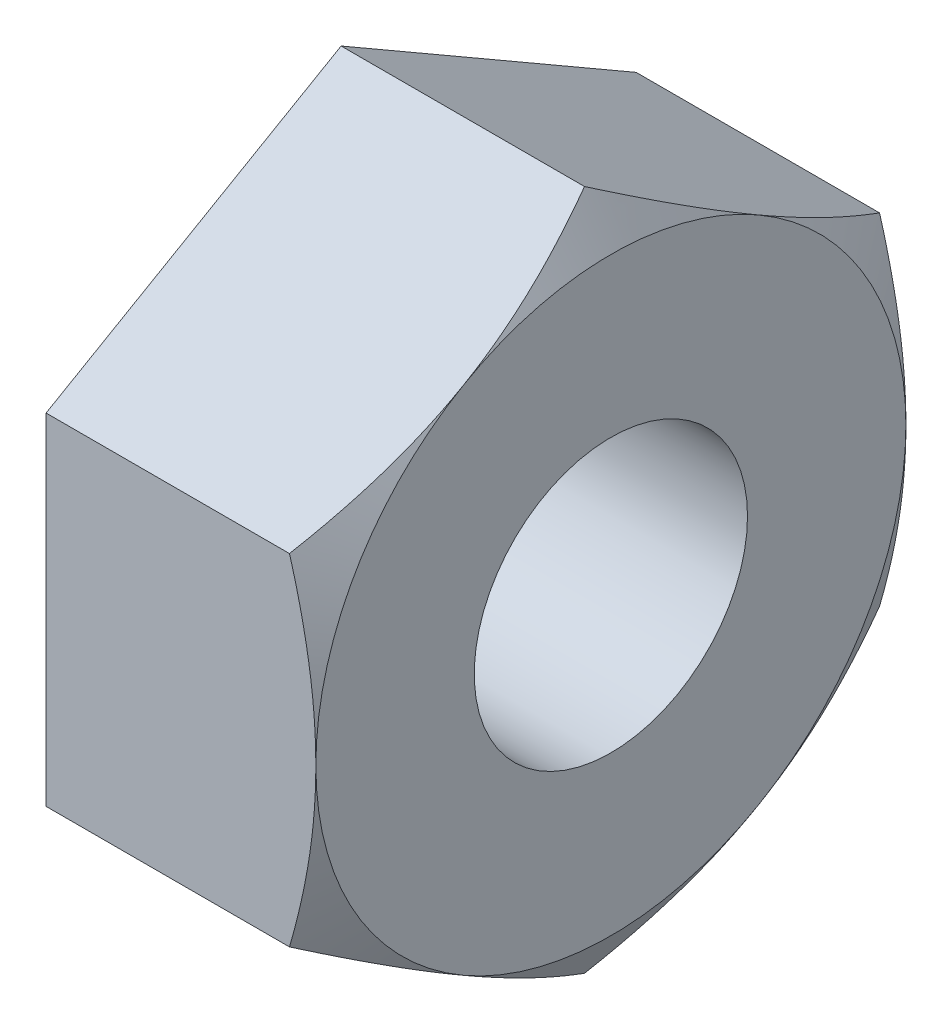
ISO-10303-21;
HEADER;
FILE_DESCRIPTION(('STEP AP214'),'2;1');
FILE_NAME('part.step','',(''),(''),'','','');
FILE_SCHEMA(('AUTOMOTIVE_DESIGN { 1 0 10303 214 1 1 1 1 }'));
ENDSEC;
DATA;
#1=APPLICATION_CONTEXT('core data for automotive mechanical design processes');
#2=APPLICATION_PROTOCOL_DEFINITION('international standard','automotive_design',2000,#1);
#3=PRODUCT_CONTEXT('',#1,'mechanical');
#4=PRODUCT('Part','Part','',(#3));
#5=PRODUCT_RELATED_PRODUCT_CATEGORY('part','',(#4));
#6=PRODUCT_DEFINITION_FORMATION('','',#4);
#7=PRODUCT_DEFINITION_CONTEXT('part definition',#1,'design');
#8=PRODUCT_DEFINITION('design','',#6,#7);
#9=PRODUCT_DEFINITION_SHAPE('','',#8);
#10=(LENGTH_UNIT() NAMED_UNIT(*) SI_UNIT(.MILLI.,.METRE.));
#11=(NAMED_UNIT(*) PLANE_ANGLE_UNIT() SI_UNIT($,.RADIAN.));
#12=(NAMED_UNIT(*) SI_UNIT($,.STERADIAN.) SOLID_ANGLE_UNIT());
#13=UNCERTAINTY_MEASURE_WITH_UNIT(LENGTH_MEASURE(1.E-05),#10,'distance_accuracy_value','');
#14=(GEOMETRIC_REPRESENTATION_CONTEXT(3) GLOBAL_UNCERTAINTY_ASSIGNED_CONTEXT((#13)) GLOBAL_UNIT_ASSIGNED_CONTEXT((#10,
#11,#12)) REPRESENTATION_CONTEXT('',''));
#15=CARTESIAN_POINT('',(0.,0.,0.));
#16=DIRECTION('',(0.,0.,1.));
#17=DIRECTION('',(1.,0.,0.));
#18=AXIS2_PLACEMENT_3D('',#15,#16,#17);
#19=CARTESIAN_POINT('',(-3.2,2.02072594216368,-3.5));
#20=DIRECTION('',(0.,0.866025403784439,-0.5));
#21=DIRECTION('',(0.,0.5,0.866025403784439));
#22=AXIS2_PLACEMENT_3D('',#19,#20,#21);
#23=PLANE('',#22);
#24=DIRECTION('',(1.,0.,0.));
#25=VECTOR('',#24,1.);
#26=CARTESIAN_POINT('',(-3.2,4.04145188432737,0.));
#27=LINE('',#26,#25);
#28=CARTESIAN_POINT('',(-3.2,4.04145188432737,0.));
#29=VERTEX_POINT('',#28);
#30=CARTESIAN_POINT('',(-0.312607391169632,4.04145188432737,0.));
#31=VERTEX_POINT('',#30);
#32=EDGE_CURVE('E213',#29,#31,#27,.T.);
#33=ORIENTED_EDGE('',*,*,#32,.T.);
#34=CARTESIAN_POINT('',(-0.31267406069336,4.04156735438121,0.000199999999999771));
#35=CARTESIAN_POINT('',(-0.261385788989973,3.95276673849839,-0.153607178452449));
#36=CARTESIAN_POINT('',(-0.214740953816187,3.86319960126197,-0.308742010834423));
#37=CARTESIAN_POINT('',(-0.13332187553334,3.68251437287561,-0.621698006576779));
#38=CARTESIAN_POINT('',(-0.0985764355845537,3.59139307116724,-0.779524730787493));
#39=CARTESIAN_POINT('',(-0.0444900271828293,3.41027974688033,-1.09322221038012));
#40=CARTESIAN_POINT('',(-0.0247890862603751,3.32031559103707,-1.24904469916069));
#41=CARTESIAN_POINT('',(-0.00127013273724807,3.13996396008051,-1.56142288720537));
#42=CARTESIAN_POINT('',(0.00256735545444128,3.04957714051105,-1.71797745103422));
#43=CARTESIAN_POINT('',(-0.00541530187697106,2.88068384499776,-2.01050921992098));
#44=CARTESIAN_POINT('',(-0.0152754340696007,2.80215208834114,-2.1465302124579));
#45=CARTESIAN_POINT('',(-0.0465264668993971,2.64560020969753,-2.41768602028899));
#46=CARTESIAN_POINT('',(-0.0679280432857915,2.56758062920649,-2.55281989768468));
#47=CARTESIAN_POINT('',(-0.12143040788057,2.41070596159677,-2.82453479240518));
#48=CARTESIAN_POINT('',(-0.15375799444508,2.33187072981462,-2.96108141927833));
#49=CARTESIAN_POINT('',(-0.227128933807987,2.17537608630782,-3.2321380929445));
#50=CARTESIAN_POINT('',(-0.268155046569859,2.09771466960097,-3.36665161246854));
#51=CARTESIAN_POINT('',(-0.312674060693363,2.02061047210984,-3.5002));
#52=B_SPLINE_CURVE_WITH_KNOTS('',3,(#34,#35,#36,#37,#38,#39,#40,#41,#42,#43,#44,#45,#46,#47,#48,
#49,#50,#51),.UNSPECIFIED.,.F.,.F.,(4,2,2,2,2,2,2,2,4),(0.,0.554793832886251,1.11092123814983,
1.65328467083218,2.19498204478402,2.66665130850859,3.13875761298267,3.62133612600509,
4.10296698719187),.UNSPECIFIED.);
#53=CARTESIAN_POINT('',(0.,3.03108891324554,-1.75));
#54=VERTEX_POINT('',#53);
#55=EDGE_CURVE('E58',#31,#54,#52,.T.);
#56=ORIENTED_EDGE('',*,*,#55,.T.);
#57=CARTESIAN_POINT('',(-0.312607391169632,2.02072594216367,-3.5));
#58=VERTEX_POINT('',#57);
#59=EDGE_CURVE('E185',#54,#58,#52,.T.);
#60=ORIENTED_EDGE('',*,*,#59,.T.);
#61=DIRECTION('',(1.,0.,0.));
#62=VECTOR('',#61,1.);
#63=CARTESIAN_POINT('',(-3.2,2.02072594216368,-3.5));
#64=LINE('',#63,#62);
#65=CARTESIAN_POINT('',(-3.2,2.02072594216368,-3.5));
#66=VERTEX_POINT('',#65);
#67=EDGE_CURVE('E233',#66,#58,#64,.T.);
#68=ORIENTED_EDGE('',*,*,#67,.F.);
#69=DIRECTION('',(0.,0.5,0.866025403784439));
#70=VECTOR('',#69,1.);
#71=CARTESIAN_POINT('',(-3.2,2.02072594216368,-3.5));
#72=LINE('',#71,#70);
#73=EDGE_CURVE('E216',#66,#29,#72,.T.);
#74=ORIENTED_EDGE('',*,*,#73,.T.);
#75=EDGE_LOOP('',(#33,#56,#60,#68,#74));
#76=FACE_BOUND('',#75,.T.);
#77=ADVANCED_FACE('F36',(#76),#23,.T.);
#78=CARTESIAN_POINT('',(-3.2,-2.0207259421637,-3.5));
#79=DIRECTION('',(0.,0.,-1.));
#80=DIRECTION('',(0.,1.,0.));
#81=AXIS2_PLACEMENT_3D('',#78,#79,#80);
#82=PLANE('',#81);
#83=ORIENTED_EDGE('',*,*,#67,.T.);
#84=CARTESIAN_POINT('',(-1.6748440724779,-5.35926424048624,-3.5));
#85=CARTESIAN_POINT('',(-1.60058231497446,-5.20559440559576,-3.5));
#86=CARTESIAN_POINT('',(-1.52705878056118,-5.0515612445436,-3.5));
#87=CARTESIAN_POINT('',(-1.38191000416732,-4.74257181977884,-3.5));
#88=CARTESIAN_POINT('',(-1.31028509085496,-4.58761540185548,-3.5));
#89=CARTESIAN_POINT('',(-1.16897807882459,-4.27574595068726,-3.5));
#90=CARTESIAN_POINT('',(-1.09930944363486,-4.1188267950521,-3.5));
#91=CARTESIAN_POINT('',(-0.962964609282973,-3.80369874616066,-3.5));
#92=CARTESIAN_POINT('',(-0.896288254138832,-3.64548992064166,-3.5));
#93=CARTESIAN_POINT('',(-0.765932090906342,-3.32556686799685,-3.5));
#94=CARTESIAN_POINT('',(-0.702299120726499,-3.16383345099895,-3.5));
#95=CARTESIAN_POINT('',(-0.580016900953806,-2.8384589571423,-3.5));
#96=CARTESIAN_POINT('',(-0.521368205835812,-2.67481767033958,-3.5));
#97=CARTESIAN_POINT('',(-0.410630410873417,-2.34570319373404,-3.5));
#98=CARTESIAN_POINT('',(-0.358527365355124,-2.18023474470139,-3.5));
#99=CARTESIAN_POINT('',(-0.262573008307886,-1.84694549539022,-3.5));
#100=CARTESIAN_POINT('',(-0.218719087285585,-1.67912545711475,-3.5));
#101=CARTESIAN_POINT('',(-0.141391963972235,-1.34101838256747,-3.5));
#102=CARTESIAN_POINT('',(-0.107921527224786,-1.1707307016812,-3.5));
#103=CARTESIAN_POINT('',(-0.0536149371423589,-0.828102254748888,-3.5));
#104=CARTESIAN_POINT('',(-0.0327787949694608,-0.655761486889137,-3.5));
#105=CARTESIAN_POINT('',(-0.00558406591599609,-0.311020130690051,-3.5));
#106=CARTESIAN_POINT('',(0.000866175296537027,-0.138626960610233,-3.5));
#107=CARTESIAN_POINT('',(-0.00105357590517546,0.206038662929245,-3.5));
#108=CARTESIAN_POINT('',(-0.00941972129227842,0.378311136109264,-3.5));
#109=CARTESIAN_POINT('',(-0.0357689751623773,0.672491314888635,-3.5));
#110=CARTESIAN_POINT('',(-0.0503207336432886,0.794723571901805,-3.5));
#111=CARTESIAN_POINT('',(-0.0859368690658876,1.03824387771235,-3.5));
#112=CARTESIAN_POINT('',(-0.107002273117114,1.15953177450311,-3.5));
#113=CARTESIAN_POINT('',(-0.178863395249658,1.52188005346714,-3.5));
#114=CARTESIAN_POINT('',(-0.238305520994604,1.76124198741876,-3.5));
#115=CARTESIAN_POINT('',(-0.340827114809805,2.11941071826357,-3.5));
#116=CARTESIAN_POINT('',(-0.377750017969913,2.24008446757473,-3.5));
#117=CARTESIAN_POINT('',(-0.455249363005877,2.48017245637076,-3.5));
#118=CARTESIAN_POINT('',(-0.495823284914263,2.59958750198735,-3.5));
#119=CARTESIAN_POINT('',(-0.579780395219146,2.83665872785758,-3.5));
#120=CARTESIAN_POINT('',(-0.623146485712761,2.95432102488641,-3.5));
#121=CARTESIAN_POINT('',(-0.712424019210114,3.18873271700618,-3.5));
#122=CARTESIAN_POINT('',(-0.758336490959493,3.30548172106715,-3.5));
#123=CARTESIAN_POINT('',(-0.805270873556984,3.42180858719338,-3.5));
#124=B_SPLINE_CURVE_WITH_KNOTS('',3,(#84,#85,#86,#87,#88,#89,#90,#91,#92,#93,#94,#95,#96,#97,
#98,#99,#100,#101,#102,#103,#104,#105,#106,#107,#108,#109,#110,#111,#112,#113,#114,#115,#116,
#117,#118,#119,#120,#121,#122,#123),.UNSPECIFIED.,.F.,.F.,(4,2,2,2,2,2,2,2,2,2,2,2,2,2,2,2,2,2,
2,4),(0.,0.512025467708518,1.02413900028468,1.53918315265711,2.05420042547922,2.57554051253682,
3.09693852027603,3.61720612610814,4.13730887487718,4.65755002944064,5.17779164362336,
5.69470915048346,6.21149246105176,6.580598429643,6.94976263071819,7.68864045992709,
8.06719870082303,8.44549763256366,8.82166724342672,9.19798995093339),.UNSPECIFIED.);
#125=CARTESIAN_POINT('',(0.,0.,-3.5));
#126=VERTEX_POINT('',#125);
#127=EDGE_CURVE('E183',#58,#126,#124,.F.);
#128=ORIENTED_EDGE('',*,*,#127,.T.);
#129=CARTESIAN_POINT('',(-0.312607391169632,-2.02072594216372,-3.49999999999997));
#130=VERTEX_POINT('',#129);
#131=EDGE_CURVE('E177',#126,#130,#124,.F.);
#132=ORIENTED_EDGE('',*,*,#131,.T.);
#133=DIRECTION('',(1.,0.,0.));
#134=VECTOR('',#133,1.);
#135=CARTESIAN_POINT('',(-3.2,-2.0207259421637,-3.5));
#136=LINE('',#135,#134);
#137=CARTESIAN_POINT('',(-3.2,-2.0207259421637,-3.5));
#138=VERTEX_POINT('',#137);
#139=EDGE_CURVE('E230',#138,#130,#136,.T.);
#140=ORIENTED_EDGE('',*,*,#139,.F.);
#141=DIRECTION('',(0.,1.,0.));
#142=VECTOR('',#141,1.);
#143=CARTESIAN_POINT('',(-3.2,-2.0207259421637,-3.5));
#144=LINE('',#143,#142);
#145=EDGE_CURVE('E221',#138,#66,#144,.T.);
#146=ORIENTED_EDGE('',*,*,#145,.T.);
#147=EDGE_LOOP('',(#83,#128,#132,#140,#146));
#148=FACE_BOUND('',#147,.T.);
#149=ADVANCED_FACE('F190',(#148),#82,.T.);
#150=CARTESIAN_POINT('',(-3.2,-4.04145188432739,0.));
#151=DIRECTION('',(0.,-0.866025403784439,-0.5));
#152=DIRECTION('',(0.,0.5,-0.866025403784439));
#153=AXIS2_PLACEMENT_3D('',#150,#151,#152);
#154=PLANE('',#153);
#155=ORIENTED_EDGE('',*,*,#139,.T.);
#156=CARTESIAN_POINT('',(-0.312674060693371,-2.02061047210987,-3.5002));
#157=CARTESIAN_POINT('',(-0.261385788989984,-2.10941108799269,-3.34639282154755));
#158=CARTESIAN_POINT('',(-0.214740953816199,-2.19897822522911,-3.19125798916558));
#159=CARTESIAN_POINT('',(-0.133321875533352,-2.37966345361546,-2.87830199342322));
#160=CARTESIAN_POINT('',(-0.0985764355845653,-2.47078475532384,-2.7204752692125));
#161=CARTESIAN_POINT('',(-0.0444900271828411,-2.65189807961075,-2.40677778961987));
#162=CARTESIAN_POINT('',(-0.024789086260387,-2.74186223545401,-2.25095530083931));
#163=CARTESIAN_POINT('',(-0.00127013273726039,-2.92221386641057,-1.93857711279462));
#164=CARTESIAN_POINT('',(0.00256735545442857,-3.01260068598003,-1.78202254896577));
#165=CARTESIAN_POINT('',(-0.00541530187698419,-3.18149398149331,-1.48949078007901));
#166=CARTESIAN_POINT('',(-0.0152754340696137,-3.26002573814994,-1.35346978754209));
#167=CARTESIAN_POINT('',(-0.0465264668994102,-3.41657761679355,-1.082313979711));
#168=CARTESIAN_POINT('',(-0.0679280432858047,-3.49459719728459,-0.947180102315316));
#169=CARTESIAN_POINT('',(-0.121430407880583,-3.6514718648943,-0.675465207594815));
#170=CARTESIAN_POINT('',(-0.153757994445092,-3.73030709667645,-0.538918580721664));
#171=CARTESIAN_POINT('',(-0.227128933807999,-3.88680174018325,-0.267861907055498));
#172=CARTESIAN_POINT('',(-0.268155046569871,-3.9644631568901,-0.133348387531463));
#173=CARTESIAN_POINT('',(-0.312674060693374,-4.04156735438123,0.000200000000000236));
#174=B_SPLINE_CURVE_WITH_KNOTS('',3,(#156,#157,#158,#159,#160,#161,#162,#163,#164,#165,#166,
#167,#168,#169,#170,#171,#172,#173),.UNSPECIFIED.,.F.,.F.,(4,2,2,2,2,2,2,2,4),(0.,
0.554793832886253,1.11092123814984,1.65328467083219,2.19498204478403,2.6666513085086,
3.13875761298267,3.62133612600509,4.10296698719187),.UNSPECIFIED.);
#175=CARTESIAN_POINT('',(0.,-3.03108891324554,-1.75));
#176=VERTEX_POINT('',#175);
#177=EDGE_CURVE('E184',#130,#176,#174,.T.);
#178=ORIENTED_EDGE('',*,*,#177,.T.);
#179=CARTESIAN_POINT('',(-0.312607391169632,-4.04145188432737,0.));
#180=VERTEX_POINT('',#179);
#181=EDGE_CURVE('E171',#176,#180,#174,.T.);
#182=ORIENTED_EDGE('',*,*,#181,.T.);
#183=DIRECTION('',(1.,0.,0.));
#184=VECTOR('',#183,1.);
#185=CARTESIAN_POINT('',(-3.2,-4.04145188432739,0.));
#186=LINE('',#185,#184);
#187=CARTESIAN_POINT('',(-3.2,-4.04145188432739,0.));
#188=VERTEX_POINT('',#187);
#189=EDGE_CURVE('E228',#188,#180,#186,.T.);
#190=ORIENTED_EDGE('',*,*,#189,.F.);
#191=DIRECTION('',(0.,0.5,-0.866025403784439));
#192=VECTOR('',#191,1.);
#193=CARTESIAN_POINT('',(-3.2,-4.04145188432739,0.));
#194=LINE('',#193,#192);
#195=EDGE_CURVE('E224',#188,#138,#194,.T.);
#196=ORIENTED_EDGE('',*,*,#195,.T.);
#197=EDGE_LOOP('',(#155,#178,#182,#190,#196));
#198=FACE_BOUND('',#197,.T.);
#199=ADVANCED_FACE('F193',(#198),#154,.T.);
#200=CARTESIAN_POINT('',(-3.2,-2.0207259421637,3.5));
#201=DIRECTION('',(0.,-0.866025403784439,0.5));
#202=DIRECTION('',(0.,-0.5,-0.866025403784439));
#203=AXIS2_PLACEMENT_3D('',#200,#201,#202);
#204=PLANE('',#203);
#205=ORIENTED_EDGE('',*,*,#189,.T.);
#206=CARTESIAN_POINT('',(-0.312674060693374,-4.04156735438123,-0.000200000000000007));
#207=CARTESIAN_POINT('',(-0.261385788989987,-3.95276673849841,0.15360717845245));
#208=CARTESIAN_POINT('',(-0.214740953816201,-3.86319960126199,0.308742010834424));
#209=CARTESIAN_POINT('',(-0.133321875533354,-3.68251437287563,0.621698006576782));
#210=CARTESIAN_POINT('',(-0.0985764355845668,-3.59139307116726,0.779524730787497));
#211=CARTESIAN_POINT('',(-0.0444900271828418,-3.41027974688035,1.09322221038013));
#212=CARTESIAN_POINT('',(-0.0247890862603873,-3.32031559103709,1.24904469916069));
#213=CARTESIAN_POINT('',(-0.00127013273726016,-3.13996396008053,1.56142288720538));
#214=CARTESIAN_POINT('',(0.00256735545442883,-3.04957714051107,1.71797745103423));
#215=CARTESIAN_POINT('',(-0.00541530187698349,-2.88068384499778,2.01050921992099));
#216=CARTESIAN_POINT('',(-0.0152754340696127,-2.80215208834115,2.14653021245791));
#217=CARTESIAN_POINT('',(-0.0465264668994084,-2.64560020969755,2.417686020289));
#218=CARTESIAN_POINT('',(-0.0679280432858026,-2.56758062920651,2.55281989768468));
#219=CARTESIAN_POINT('',(-0.12143040788058,-2.4107059615968,2.82453479240519));
#220=CARTESIAN_POINT('',(-0.153757994445089,-2.33187072981465,2.96108141927834));
#221=CARTESIAN_POINT('',(-0.227128933807995,-2.17537608630784,3.2321380929445));
#222=CARTESIAN_POINT('',(-0.268155046569867,-2.097714669601,3.36665161246854));
#223=CARTESIAN_POINT('',(-0.312674060693371,-2.02061047210986,3.5002));
#224=B_SPLINE_CURVE_WITH_KNOTS('',3,(#206,#207,#208,#209,#210,#211,#212,#213,#214,#215,#216,
#217,#218,#219,#220,#221,#222,#223),.UNSPECIFIED.,.F.,.F.,(4,2,2,2,2,2,2,2,4),(0.,
0.554793832886255,1.11092123814984,1.65328467083219,2.19498204478403,2.6666513085086,
3.13875761298267,3.6213361260051,4.10296698719187),.UNSPECIFIED.);
#225=CARTESIAN_POINT('',(0.,-3.03108891324554,1.75));
#226=VERTEX_POINT('',#225);
#227=EDGE_CURVE('E140',#180,#226,#224,.T.);
#228=ORIENTED_EDGE('',*,*,#227,.T.);
#229=CARTESIAN_POINT('',(-0.312607391169632,-2.02072594216366,3.5));
#230=VERTEX_POINT('',#229);
#231=EDGE_CURVE('E125',#226,#230,#224,.T.);
#232=ORIENTED_EDGE('',*,*,#231,.T.);
#233=DIRECTION('',(1.,0.,0.));
#234=VECTOR('',#233,1.);
#235=CARTESIAN_POINT('',(-3.2,-2.0207259421637,3.5));
#236=LINE('',#235,#234);
#237=CARTESIAN_POINT('',(-3.2,-2.0207259421637,3.5));
#238=VERTEX_POINT('',#237);
#239=EDGE_CURVE('E139',#238,#230,#236,.T.);
#240=ORIENTED_EDGE('',*,*,#239,.F.);
#241=DIRECTION('',(0.,-0.5,-0.866025403784439));
#242=VECTOR('',#241,1.);
#243=CARTESIAN_POINT('',(-3.2,-2.0207259421637,3.5));
#244=LINE('',#243,#242);
#245=EDGE_CURVE('E238',#238,#188,#244,.T.);
#246=ORIENTED_EDGE('',*,*,#245,.T.);
#247=EDGE_LOOP('',(#205,#228,#232,#240,#246));
#248=FACE_BOUND('',#247,.T.);
#249=ADVANCED_FACE('F197',(#248),#204,.T.);
#250=CARTESIAN_POINT('',(-3.2,2.02072594216368,3.5));
#251=DIRECTION('',(0.,0.,1.));
#252=DIRECTION('',(1.,0.,0.));
#253=AXIS2_PLACEMENT_3D('',#250,#251,#252);
#254=PLANE('',#253);
#255=ORIENTED_EDGE('',*,*,#239,.T.);
#256=CARTESIAN_POINT('',(-1.67484346858554,-5.35926299121406,3.5));
#257=CARTESIAN_POINT('',(-1.60058173692102,-5.20559319908843,3.5));
#258=CARTESIAN_POINT('',(-1.52705822833145,-5.05156008083376,3.5));
#259=CARTESIAN_POINT('',(-1.3819095034475,-4.74257074180711,3.5));
#260=CARTESIAN_POINT('',(-1.31028461582131,-4.58761436682437,3.5));
#261=CARTESIAN_POINT('',(-1.16897765517622,-4.27574500225543,3.5));
#262=CARTESIAN_POINT('',(-1.09930904568014,-4.11882589028192,3.5));
#263=CARTESIAN_POINT('',(-0.962964262242748,-3.80369792903856,3.5));
#264=CARTESIAN_POINT('',(-0.896287932319507,-3.64548914750596,3.5));
#265=CARTESIAN_POINT('',(-0.765931819095058,-3.32556618401856,3.5));
#266=CARTESIAN_POINT('',(-0.702298873688857,-3.16383281219924,3.5));
#267=CARTESIAN_POINT('',(-0.580016702089486,-2.83845840945598,3.5));
#268=CARTESIAN_POINT('',(-0.521368030370686,-2.67481716858827,3.5));
#269=CARTESIAN_POINT('',(-0.410630279877018,-2.3457027847205,3.5));
#270=CARTESIAN_POINT('',(-0.358527255435855,-2.18023438248743,3.5));
#271=CARTESIAN_POINT('',(-0.262572936976441,-1.8469452280637,3.5));
#272=CARTESIAN_POINT('',(-0.218719033467157,-1.67912523787531,3.5));
#273=CARTESIAN_POINT('',(-0.141391945584786,-1.34101828610926,3.5));
#274=CARTESIAN_POINT('',(-0.107921525211973,-1.17073068027694,3.5));
#275=CARTESIAN_POINT('',(-0.0536149564320511,-0.828102385138493,3.5));
#276=CARTESIAN_POINT('',(-0.0327788191952372,-0.655761694017311,3.5));
#277=CARTESIAN_POINT('',(-0.00558408650575725,-0.311020490924459,3.5));
#278=CARTESIAN_POINT('',(0.000866163165910828,-0.138627397207269,3.5));
#279=CARTESIAN_POINT('',(-0.00105355807794607,0.206038074906525,3.5));
#280=CARTESIAN_POINT('',(-0.0094196819634315,0.378310473023169,3.5));
#281=CARTESIAN_POINT('',(-0.035768892786891,0.672490555822319,3.5));
#282=CARTESIAN_POINT('',(-0.0503206340384201,0.794722791084085,3.5));
#283=CARTESIAN_POINT('',(-0.0859367340533543,1.0382430543056,3.5));
#284=CARTESIAN_POINT('',(-0.10700211992614,1.15953093025887,3.5));
#285=CARTESIAN_POINT('',(-0.178863187081451,1.52187914771349,3.5));
#286=CARTESIAN_POINT('',(-0.238305275622009,1.76124104212633,3.5));
#287=CARTESIAN_POINT('',(-0.340826814402554,2.1194097138771,3.5));
#288=CARTESIAN_POINT('',(-0.377749699085183,2.24008344316348,3.5));
#289=CARTESIAN_POINT('',(-0.455249007699294,2.48017139213731,3.5));
#290=CARTESIAN_POINT('',(-0.495822911663551,2.59958641795615,3.5));
#291=CARTESIAN_POINT('',(-0.579779986782753,2.83665760451801,3.5));
#292=CARTESIAN_POINT('',(-0.623146060034316,2.95431988203486,3.5));
#293=CARTESIAN_POINT('',(-0.712423559566868,3.18873153508803,3.5));
#294=CARTESIAN_POINT('',(-0.758336014592952,3.30548051959467,3.5));
#295=CARTESIAN_POINT('',(-0.805270380724073,3.42180736613353,3.5));
#296=B_SPLINE_CURVE_WITH_KNOTS('',3,(#256,#257,#258,#259,#260,#261,#262,#263,#264,#265,#266,
#267,#268,#269,#270,#271,#272,#273,#274,#275,#276,#277,#278,#279,#280,#281,#282,#283,#284,#285,
#286,#287,#288,#289,#290,#291,#292,#293,#294,#295),.UNSPECIFIED.,.F.,.F.,(4,2,2,2,2,2,2,2,2,2,2,
2,2,2,2,2,2,2,2,4),(0.,0.512025318465737,1.02413870177436,1.53918270315241,2.05419982499223,
2.57553975872798,3.09693761309352,3.617205066104,4.13730766217537,4.65754858684364,
5.1777899714696,5.69470725122281,6.211490334524,6.58059623222331,6.94976036239485,
7.68863804939852,8.0671962166048,8.44549507476763,8.82166461280102,9.19798724733414),.UNSPECIFIED.);
#297=CARTESIAN_POINT('',(0.,0.,3.5));
#298=VERTEX_POINT('',#297);
#299=EDGE_CURVE('E118',#230,#298,#296,.T.);
#300=ORIENTED_EDGE('',*,*,#299,.T.);
#301=CARTESIAN_POINT('',(-0.312607391169632,2.02072594216369,3.49999999999999));
#302=VERTEX_POINT('',#301);
#303=EDGE_CURVE('E107',#298,#302,#296,.T.);
#304=ORIENTED_EDGE('',*,*,#303,.T.);
#305=DIRECTION('',(1.,0.,0.));
#306=VECTOR('',#305,1.);
#307=CARTESIAN_POINT('',(-3.2,2.02072594216368,3.5));
#308=LINE('',#307,#306);
#309=CARTESIAN_POINT('',(-3.2,2.02072594216368,3.5));
#310=VERTEX_POINT('',#309);
#311=EDGE_CURVE('E220',#310,#302,#308,.T.);
#312=ORIENTED_EDGE('',*,*,#311,.F.);
#313=DIRECTION('',(0.,-1.,0.));
#314=VECTOR('',#313,1.);
#315=CARTESIAN_POINT('',(-3.2,2.02072594216368,3.5));
#316=LINE('',#315,#314);
#317=EDGE_CURVE('E241',#310,#238,#316,.T.);
#318=ORIENTED_EDGE('',*,*,#317,.T.);
#319=EDGE_LOOP('',(#255,#300,#304,#312,#318));
#320=FACE_BOUND('',#319,.T.);
#321=ADVANCED_FACE('F137',(#320),#254,.T.);
#322=CARTESIAN_POINT('',(-3.2,4.04145188432737,0.));
#323=DIRECTION('',(0.,0.866025403784439,0.5));
#324=DIRECTION('',(0.,-0.5,0.866025403784439));
#325=AXIS2_PLACEMENT_3D('',#322,#323,#324);
#326=PLANE('',#325);
#327=ORIENTED_EDGE('',*,*,#311,.T.);
#328=CARTESIAN_POINT('',(-0.312674060693363,2.02061047210984,3.5002));
#329=CARTESIAN_POINT('',(-0.261385788989976,2.10941108799266,3.34639282154755));
#330=CARTESIAN_POINT('',(-0.21474095381619,2.19897822522908,3.19125798916558));
#331=CARTESIAN_POINT('',(-0.133321875533343,2.37966345361544,2.87830199342322));
#332=CARTESIAN_POINT('',(-0.098576435584556,2.47078475532381,2.72047526921251));
#333=CARTESIAN_POINT('',(-0.0444900271828307,2.65189807961072,2.40677778961988));
#334=CARTESIAN_POINT('',(-0.024789086260376,2.74186223545398,2.25095530083931));
#335=CARTESIAN_POINT('',(-0.00127013273724833,2.92221386641054,1.93857711279463));
#336=CARTESIAN_POINT('',(0.00256735545444104,3.01260068598,1.78202254896578));
#337=CARTESIAN_POINT('',(-0.00541530187697061,3.18149398149328,1.48949078007902));
#338=CARTESIAN_POINT('',(-0.0152754340695996,3.26002573814991,1.3534697875421));
#339=CARTESIAN_POINT('',(-0.0465264668993953,3.41657761679352,1.08231397971101));
#340=CARTESIAN_POINT('',(-0.0679280432857896,3.49459719728456,0.947180102315321));
#341=CARTESIAN_POINT('',(-0.121430407880568,3.65147186489427,0.675465207594818));
#342=CARTESIAN_POINT('',(-0.153757994445077,3.73030709667642,0.538918580721666));
#343=CARTESIAN_POINT('',(-0.227128933807984,3.88680174018323,0.267861907055499));
#344=CARTESIAN_POINT('',(-0.268155046569856,3.96446315689008,0.133348387531463));
#345=CARTESIAN_POINT('',(-0.31267406069336,4.04156735438121,-0.000200000000000616));
#346=B_SPLINE_CURVE_WITH_KNOTS('',3,(#328,#329,#330,#331,#332,#333,#334,#335,#336,#337,#338,
#339,#340,#341,#342,#343,#344,#345),.UNSPECIFIED.,.F.,.F.,(4,2,2,2,2,2,2,2,4),(0.,
0.554793832886252,1.11092123814983,1.65328467083218,2.19498204478402,2.66665130850859,
3.13875761298267,3.62133612600509,4.10296698719187),.UNSPECIFIED.);
#347=CARTESIAN_POINT('',(0.,3.03108891324554,1.75));
#348=VERTEX_POINT('',#347);
#349=EDGE_CURVE('E114',#302,#348,#346,.T.);
#350=ORIENTED_EDGE('',*,*,#349,.T.);
#351=EDGE_CURVE('E133',#348,#31,#346,.T.);
#352=ORIENTED_EDGE('',*,*,#351,.T.);
#353=ORIENTED_EDGE('',*,*,#32,.F.);
#354=DIRECTION('',(0.,-0.5,0.866025403784439));
#355=VECTOR('',#354,1.);
#356=CARTESIAN_POINT('',(-3.2,4.04145188432737,0.));
#357=LINE('',#356,#355);
#358=EDGE_CURVE('E243',#29,#310,#357,.T.);
#359=ORIENTED_EDGE('',*,*,#358,.T.);
#360=EDGE_LOOP('',(#327,#350,#352,#353,#359));
#361=FACE_BOUND('',#360,.T.);
#362=ADVANCED_FACE('F205',(#361),#326,.T.);
#363=CARTESIAN_POINT('',(-3.2,0.,0.));
#364=DIRECTION('',(1.,0.,0.));
#365=DIRECTION('',(0.,0.,-1.));
#366=AXIS2_PLACEMENT_3D('',#363,#364,#365);
#367=PLANE('',#366);
#368=CARTESIAN_POINT('',(-3.2,0.,0.));
#369=DIRECTION('',(1.,0.,0.));
#370=DIRECTION('',(0.,0.,-1.));
#371=AXIS2_PLACEMENT_3D('',#368,#369,#370);
#372=CIRCLE('',#371,1.621);
#373=CARTESIAN_POINT('',(-3.2,0.,-1.621));
#374=VERTEX_POINT('',#373);
#375=EDGE_CURVE('E134',#374,#374,#372,.T.);
#376=ORIENTED_EDGE('',*,*,#375,.T.);
#377=EDGE_LOOP('',(#376));
#378=FACE_BOUND('',#377,.T.);
#379=ORIENTED_EDGE('',*,*,#73,.F.);
#380=ORIENTED_EDGE('',*,*,#145,.F.);
#381=ORIENTED_EDGE('',*,*,#195,.F.);
#382=ORIENTED_EDGE('',*,*,#245,.F.);
#383=ORIENTED_EDGE('',*,*,#317,.F.);
#384=ORIENTED_EDGE('',*,*,#358,.F.);
#385=EDGE_LOOP('',(#379,#380,#381,#382,#383,#384));
#386=FACE_BOUND('',#385,.T.);
#387=ADVANCED_FACE('F163',(#378,#386),#367,.F.);
#388=CARTESIAN_POINT('',(-0.312607391169632,0.,0.));
#389=DIRECTION('',(-1.,0.,0.));
#390=DIRECTION('',(0.,0.,1.));
#391=AXIS2_PLACEMENT_3D('',#388,#389,#390);
#392=CONICAL_SURFACE('',#391,4.04145188432737,1.0471975511966);
#393=CARTESIAN_POINT('',(0.,0.,0.));
#394=DIRECTION('',(1.,0.,0.));
#395=DIRECTION('',(0.,0.,-1.));
#396=AXIS2_PLACEMENT_3D('',#393,#394,#395);
#397=CIRCLE('',#396,3.5);
#398=EDGE_CURVE('E40',#176,#126,#397,.T.);
#399=ORIENTED_EDGE('',*,*,#398,.F.);
#400=ORIENTED_EDGE('',*,*,#177,.F.);
#401=ORIENTED_EDGE('',*,*,#131,.F.);
#402=EDGE_LOOP('',(#399,#400,#401));
#403=FACE_BOUND('',#402,.T.);
#404=ADVANCED_FACE('F249',(#403),#392,.T.);
#405=EDGE_CURVE('E130',#226,#176,#397,.T.);
#406=ORIENTED_EDGE('',*,*,#405,.F.);
#407=ORIENTED_EDGE('',*,*,#227,.F.);
#408=ORIENTED_EDGE('',*,*,#181,.F.);
#409=EDGE_LOOP('',(#406,#407,#408));
#410=FACE_BOUND('',#409,.T.);
#411=ADVANCED_FACE('F252',(#410),#392,.T.);
#412=EDGE_CURVE('E122',#298,#226,#397,.T.);
#413=ORIENTED_EDGE('',*,*,#412,.F.);
#414=ORIENTED_EDGE('',*,*,#299,.F.);
#415=ORIENTED_EDGE('',*,*,#231,.F.);
#416=EDGE_LOOP('',(#413,#414,#415));
#417=FACE_BOUND('',#416,.T.);
#418=ADVANCED_FACE('F123',(#417),#392,.T.);
#419=CARTESIAN_POINT('',(0.,0.,0.));
#420=DIRECTION('',(-1.,0.,0.));
#421=DIRECTION('',(0.,0.,1.));
#422=AXIS2_PLACEMENT_3D('',#419,#420,#421);
#423=CIRCLE('',#422,3.5);
#424=EDGE_CURVE('E111',#298,#348,#423,.T.);
#425=ORIENTED_EDGE('',*,*,#424,.T.);
#426=ORIENTED_EDGE('',*,*,#349,.F.);
#427=ORIENTED_EDGE('',*,*,#303,.F.);
#428=EDGE_LOOP('',(#425,#426,#427));
#429=FACE_BOUND('',#428,.T.);
#430=ADVANCED_FACE('F109',(#429),#392,.T.);
#431=ORIENTED_EDGE('',*,*,#351,.F.);
#432=EDGE_CURVE('E45',#54,#348,#397,.T.);
#433=ORIENTED_EDGE('',*,*,#432,.F.);
#434=ORIENTED_EDGE('',*,*,#55,.F.);
#435=EDGE_LOOP('',(#431,#433,#434));
#436=FACE_BOUND('',#435,.T.);
#437=ADVANCED_FACE('F161',(#436),#392,.T.);
#438=EDGE_CURVE('E11',#126,#54,#397,.T.);
#439=ORIENTED_EDGE('',*,*,#438,.F.);
#440=ORIENTED_EDGE('',*,*,#127,.F.);
#441=ORIENTED_EDGE('',*,*,#59,.F.);
#442=EDGE_LOOP('',(#439,#440,#441));
#443=FACE_BOUND('',#442,.T.);
#444=ADVANCED_FACE('F245',(#443),#392,.T.);
#445=CARTESIAN_POINT('',(0.,0.,0.));
#446=DIRECTION('',(1.,0.,0.));
#447=DIRECTION('',(0.,0.,-1.));
#448=AXIS2_PLACEMENT_3D('',#445,#446,#447);
#449=PLANE('',#448);
#450=CARTESIAN_POINT('',(0.,0.,0.));
#451=DIRECTION('',(1.,0.,0.));
#452=DIRECTION('',(0.,0.,-1.));
#453=AXIS2_PLACEMENT_3D('',#450,#451,#452);
#454=CIRCLE('',#453,1.621);
#455=CARTESIAN_POINT('',(0.,0.,-1.621));
#456=VERTEX_POINT('',#455);
#457=EDGE_CURVE('E373',#456,#456,#454,.T.);
#458=ORIENTED_EDGE('',*,*,#457,.F.);
#459=EDGE_LOOP('',(#458));
#460=FACE_BOUND('',#459,.T.);
#461=ORIENTED_EDGE('',*,*,#398,.T.);
#462=ORIENTED_EDGE('',*,*,#438,.T.);
#463=ORIENTED_EDGE('',*,*,#432,.T.);
#464=ORIENTED_EDGE('',*,*,#424,.F.);
#465=ORIENTED_EDGE('',*,*,#412,.T.);
#466=ORIENTED_EDGE('',*,*,#405,.T.);
#467=EDGE_LOOP('',(#461,#462,#463,#464,#465,#466));
#468=FACE_BOUND('',#467,.T.);
#469=ADVANCED_FACE('F132',(#460,#468),#449,.T.);
#470=CARTESIAN_POINT('',(0.,0.,0.));
#471=DIRECTION('',(1.,0.,0.));
#472=DIRECTION('',(0.,0.,-1.));
#473=AXIS2_PLACEMENT_3D('',#470,#471,#472);
#474=CYLINDRICAL_SURFACE('',#473,1.621);
#475=ORIENTED_EDGE('',*,*,#375,.F.);
#476=EDGE_LOOP('',(#475));
#477=FACE_BOUND('',#476,.T.);
#478=ORIENTED_EDGE('',*,*,#457,.T.);
#479=EDGE_LOOP('',(#478));
#480=FACE_BOUND('',#479,.T.);
#481=ADVANCED_FACE('F162',(#477,#480),#474,.F.);
#482=CLOSED_SHELL('',(#77,#149,#199,#249,#321,#362,#387,#404,#411,#418,#430,#437,#444,#469,#481));
#483=MANIFOLD_SOLID_BREP('B2',#482);
#484=ADVANCED_BREP_SHAPE_REPRESENTATION('',(#18,#483),#14);
#485=SHAPE_DEFINITION_REPRESENTATION(#9,#484);
ENDSEC;
END-ISO-10303-21;
